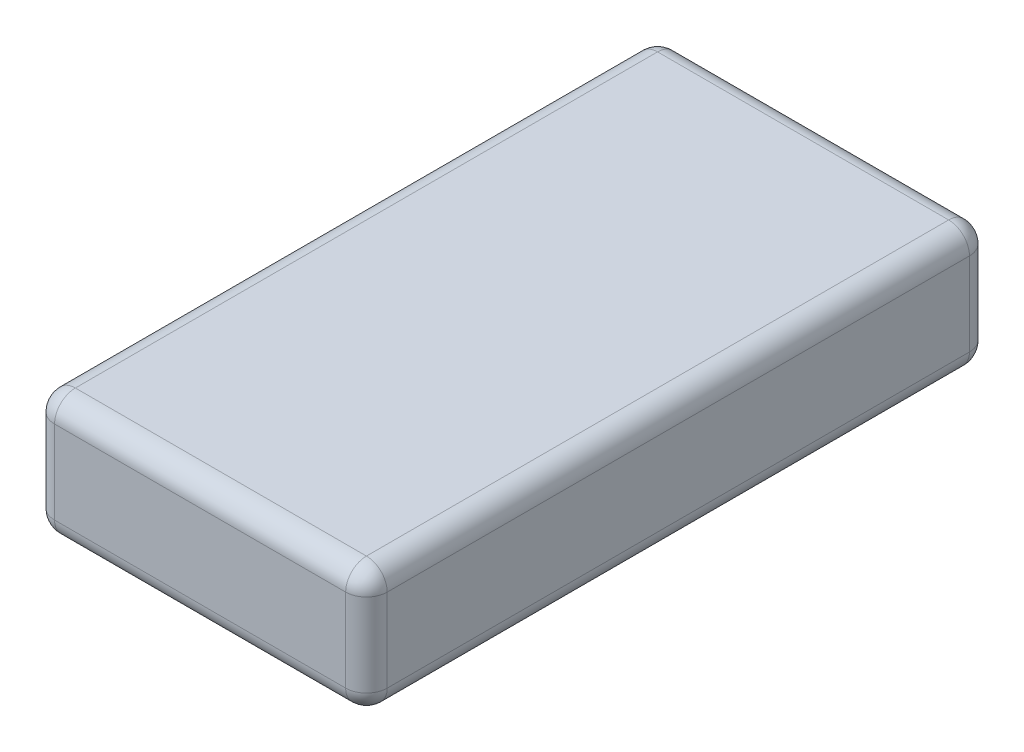
ISO-10303-21;
HEADER;
FILE_DESCRIPTION(('STEP AP214'),'2;1');
FILE_NAME('part.step','',(''),(''),'','','');
FILE_SCHEMA(('AUTOMOTIVE_DESIGN { 1 0 10303 214 1 1 1 1 }'));
ENDSEC;
DATA;
#1=APPLICATION_CONTEXT('core data for automotive mechanical design processes');
#2=APPLICATION_PROTOCOL_DEFINITION('international standard','automotive_design',2000,#1);
#3=PRODUCT_CONTEXT('',#1,'mechanical');
#4=PRODUCT('Part','Part','',(#3));
#5=PRODUCT_RELATED_PRODUCT_CATEGORY('part','',(#4));
#6=PRODUCT_DEFINITION_FORMATION('','',#4);
#7=PRODUCT_DEFINITION_CONTEXT('part definition',#1,'design');
#8=PRODUCT_DEFINITION('design','',#6,#7);
#9=PRODUCT_DEFINITION_SHAPE('','',#8);
#10=(LENGTH_UNIT() NAMED_UNIT(*) SI_UNIT(.MILLI.,.METRE.));
#11=(NAMED_UNIT(*) PLANE_ANGLE_UNIT() SI_UNIT($,.RADIAN.));
#12=(NAMED_UNIT(*) SI_UNIT($,.STERADIAN.) SOLID_ANGLE_UNIT());
#13=UNCERTAINTY_MEASURE_WITH_UNIT(LENGTH_MEASURE(1.E-05),#10,'distance_accuracy_value','');
#14=(GEOMETRIC_REPRESENTATION_CONTEXT(3) GLOBAL_UNCERTAINTY_ASSIGNED_CONTEXT((#13)) GLOBAL_UNIT_ASSIGNED_CONTEXT((#10,
#11,#12)) REPRESENTATION_CONTEXT('',''));
#15=CARTESIAN_POINT('',(0.,0.,0.));
#16=DIRECTION('',(0.,0.,1.));
#17=DIRECTION('',(1.,0.,0.));
#18=AXIS2_PLACEMENT_3D('',#15,#16,#17);
#19=CARTESIAN_POINT('',(-16.,12.,-30.));
#20=DIRECTION('',(1.,0.,0.));
#21=DIRECTION('',(0.,0.,-1.));
#22=AXIS2_PLACEMENT_3D('',#19,#20,#21);
#23=PLANE('',#22);
#24=DIRECTION('',(0.,-1.,0.));
#25=VECTOR('',#24,1.);
#26=CARTESIAN_POINT('',(-16.,12.,28.));
#27=LINE('',#26,#25);
#28=CARTESIAN_POINT('',(-16.,2.,28.));
#29=VERTEX_POINT('',#28);
#30=CARTESIAN_POINT('',(-16.,10.,28.));
#31=VERTEX_POINT('',#30);
#32=EDGE_CURVE('E136',#29,#31,#27,.F.);
#33=ORIENTED_EDGE('',*,*,#32,.T.);
#34=DIRECTION('',(0.,0.,1.));
#35=VECTOR('',#34,1.);
#36=CARTESIAN_POINT('',(-16.,10.,-30.));
#37=LINE('',#36,#35);
#38=CARTESIAN_POINT('',(-16.,10.,-28.));
#39=VERTEX_POINT('',#38);
#40=EDGE_CURVE('E182',#31,#39,#37,.F.);
#41=ORIENTED_EDGE('',*,*,#40,.T.);
#42=DIRECTION('',(0.,-1.,0.));
#43=VECTOR('',#42,1.);
#44=CARTESIAN_POINT('',(-16.,12.,-28.));
#45=LINE('',#44,#43);
#46=CARTESIAN_POINT('',(-16.,2.,-28.));
#47=VERTEX_POINT('',#46);
#48=EDGE_CURVE('E177',#39,#47,#45,.T.);
#49=ORIENTED_EDGE('',*,*,#48,.T.);
#50=DIRECTION('',(0.,0.,1.));
#51=VECTOR('',#50,1.);
#52=CARTESIAN_POINT('',(-16.,2.,-30.));
#53=LINE('',#52,#51);
#54=EDGE_CURVE('E171',#47,#29,#53,.T.);
#55=ORIENTED_EDGE('',*,*,#54,.T.);
#56=EDGE_LOOP('',(#33,#41,#49,#55));
#57=FACE_BOUND('',#56,.T.);
#58=ADVANCED_FACE('F39',(#57),#23,.F.);
#59=CARTESIAN_POINT('',(-16.,12.,30.));
#60=DIRECTION('',(0.,0.,-1.));
#61=DIRECTION('',(-1.,0.,0.));
#62=AXIS2_PLACEMENT_3D('',#59,#60,#61);
#63=PLANE('',#62);
#64=DIRECTION('',(0.,-1.,0.));
#65=VECTOR('',#64,1.);
#66=CARTESIAN_POINT('',(14.,12.,30.));
#67=LINE('',#66,#65);
#68=CARTESIAN_POINT('',(14.,2.,30.));
#69=VERTEX_POINT('',#68);
#70=CARTESIAN_POINT('',(14.,10.,30.));
#71=VERTEX_POINT('',#70);
#72=EDGE_CURVE('E161',#69,#71,#67,.F.);
#73=ORIENTED_EDGE('',*,*,#72,.T.);
#74=DIRECTION('',(1.,0.,0.));
#75=VECTOR('',#74,1.);
#76=CARTESIAN_POINT('',(-16.,10.,30.));
#77=LINE('',#76,#75);
#78=CARTESIAN_POINT('',(-14.,10.,30.));
#79=VERTEX_POINT('',#78);
#80=EDGE_CURVE('E165',#71,#79,#77,.F.);
#81=ORIENTED_EDGE('',*,*,#80,.T.);
#82=DIRECTION('',(0.,-1.,0.));
#83=VECTOR('',#82,1.);
#84=CARTESIAN_POINT('',(-14.,12.,30.));
#85=LINE('',#84,#83);
#86=CARTESIAN_POINT('',(-14.,2.,30.));
#87=VERTEX_POINT('',#86);
#88=EDGE_CURVE('E134',#79,#87,#85,.T.);
#89=ORIENTED_EDGE('',*,*,#88,.T.);
#90=DIRECTION('',(1.,0.,0.));
#91=VECTOR('',#90,1.);
#92=CARTESIAN_POINT('',(-16.,2.,30.));
#93=LINE('',#92,#91);
#94=EDGE_CURVE('E154',#87,#69,#93,.T.);
#95=ORIENTED_EDGE('',*,*,#94,.T.);
#96=EDGE_LOOP('',(#73,#81,#89,#95));
#97=FACE_BOUND('',#96,.T.);
#98=ADVANCED_FACE('F163',(#97),#63,.F.);
#99=CARTESIAN_POINT('',(16.,12.,-30.));
#100=DIRECTION('',(-1.,0.,0.));
#101=DIRECTION('',(0.,0.,1.));
#102=AXIS2_PLACEMENT_3D('',#99,#100,#101);
#103=PLANE('',#102);
#104=DIRECTION('',(0.,-1.,0.));
#105=VECTOR('',#104,1.);
#106=CARTESIAN_POINT('',(16.,12.,-28.));
#107=LINE('',#106,#105);
#108=CARTESIAN_POINT('',(16.,2.,-28.));
#109=VERTEX_POINT('',#108);
#110=CARTESIAN_POINT('',(16.,10.,-28.));
#111=VERTEX_POINT('',#110);
#112=EDGE_CURVE('E188',#109,#111,#107,.F.);
#113=ORIENTED_EDGE('',*,*,#112,.T.);
#114=DIRECTION('',(0.,0.,-1.));
#115=VECTOR('',#114,1.);
#116=CARTESIAN_POINT('',(16.,10.,30.));
#117=LINE('',#116,#115);
#118=CARTESIAN_POINT('',(16.,10.,28.));
#119=VERTEX_POINT('',#118);
#120=EDGE_CURVE('E195',#111,#119,#117,.F.);
#121=ORIENTED_EDGE('',*,*,#120,.T.);
#122=DIRECTION('',(0.,-1.,0.));
#123=VECTOR('',#122,1.);
#124=CARTESIAN_POINT('',(16.,12.,28.));
#125=LINE('',#124,#123);
#126=CARTESIAN_POINT('',(16.,2.,28.));
#127=VERTEX_POINT('',#126);
#128=EDGE_CURVE('E191',#119,#127,#125,.T.);
#129=ORIENTED_EDGE('',*,*,#128,.T.);
#130=DIRECTION('',(0.,0.,-1.));
#131=VECTOR('',#130,1.);
#132=CARTESIAN_POINT('',(16.,2.,-30.));
#133=LINE('',#132,#131);
#134=EDGE_CURVE('E185',#127,#109,#133,.T.);
#135=ORIENTED_EDGE('',*,*,#134,.T.);
#136=EDGE_LOOP('',(#113,#121,#129,#135));
#137=FACE_BOUND('',#136,.T.);
#138=ADVANCED_FACE('F334',(#137),#103,.F.);
#139=CARTESIAN_POINT('',(-16.,12.,-30.));
#140=DIRECTION('',(0.,0.,1.));
#141=DIRECTION('',(1.,0.,0.));
#142=AXIS2_PLACEMENT_3D('',#139,#140,#141);
#143=PLANE('',#142);
#144=DIRECTION('',(0.,-1.,0.));
#145=VECTOR('',#144,1.);
#146=CARTESIAN_POINT('',(-14.,12.,-30.));
#147=LINE('',#146,#145);
#148=CARTESIAN_POINT('',(-14.,2.,-30.));
#149=VERTEX_POINT('',#148);
#150=CARTESIAN_POINT('',(-14.,10.,-30.));
#151=VERTEX_POINT('',#150);
#152=EDGE_CURVE('E201',#149,#151,#147,.F.);
#153=ORIENTED_EDGE('',*,*,#152,.T.);
#154=DIRECTION('',(-1.,0.,0.));
#155=VECTOR('',#154,1.);
#156=CARTESIAN_POINT('',(16.,10.,-30.));
#157=LINE('',#156,#155);
#158=CARTESIAN_POINT('',(14.,10.,-30.));
#159=VERTEX_POINT('',#158);
#160=EDGE_CURVE('E208',#151,#159,#157,.F.);
#161=ORIENTED_EDGE('',*,*,#160,.T.);
#162=DIRECTION('',(0.,-1.,0.));
#163=VECTOR('',#162,1.);
#164=CARTESIAN_POINT('',(14.,12.,-30.));
#165=LINE('',#164,#163);
#166=CARTESIAN_POINT('',(14.,2.,-30.));
#167=VERTEX_POINT('',#166);
#168=EDGE_CURVE('E204',#159,#167,#165,.T.);
#169=ORIENTED_EDGE('',*,*,#168,.T.);
#170=DIRECTION('',(-1.,0.,0.));
#171=VECTOR('',#170,1.);
#172=CARTESIAN_POINT('',(-16.,2.,-30.));
#173=LINE('',#172,#171);
#174=EDGE_CURVE('E198',#167,#149,#173,.T.);
#175=ORIENTED_EDGE('',*,*,#174,.T.);
#176=EDGE_LOOP('',(#153,#161,#169,#175));
#177=FACE_BOUND('',#176,.T.);
#178=ADVANCED_FACE('F345',(#177),#143,.F.);
#179=CARTESIAN_POINT('',(0.,12.,0.));
#180=DIRECTION('',(0.,1.,0.));
#181=DIRECTION('',(0.,0.,1.));
#182=AXIS2_PLACEMENT_3D('',#179,#180,#181);
#183=PLANE('',#182);
#184=DIRECTION('',(0.,0.,-1.));
#185=VECTOR('',#184,1.);
#186=CARTESIAN_POINT('',(14.,12.,-30.));
#187=LINE('',#186,#185);
#188=CARTESIAN_POINT('',(14.,12.,28.));
#189=VERTEX_POINT('',#188);
#190=CARTESIAN_POINT('',(14.,12.,-28.));
#191=VERTEX_POINT('',#190);
#192=EDGE_CURVE('E217',#189,#191,#187,.T.);
#193=ORIENTED_EDGE('',*,*,#192,.T.);
#194=DIRECTION('',(-1.,0.,0.));
#195=VECTOR('',#194,1.);
#196=CARTESIAN_POINT('',(-16.,12.,-28.));
#197=LINE('',#196,#195);
#198=CARTESIAN_POINT('',(-14.,12.,-28.));
#199=VERTEX_POINT('',#198);
#200=EDGE_CURVE('E220',#191,#199,#197,.T.);
#201=ORIENTED_EDGE('',*,*,#200,.T.);
#202=DIRECTION('',(0.,0.,1.));
#203=VECTOR('',#202,1.);
#204=CARTESIAN_POINT('',(-14.,12.,30.));
#205=LINE('',#204,#203);
#206=CARTESIAN_POINT('',(-14.,12.,28.));
#207=VERTEX_POINT('',#206);
#208=EDGE_CURVE('E211',#199,#207,#205,.T.);
#209=ORIENTED_EDGE('',*,*,#208,.T.);
#210=DIRECTION('',(1.,0.,0.));
#211=VECTOR('',#210,1.);
#212=CARTESIAN_POINT('',(16.,12.,28.));
#213=LINE('',#212,#211);
#214=EDGE_CURVE('E214',#207,#189,#213,.T.);
#215=ORIENTED_EDGE('',*,*,#214,.T.);
#216=EDGE_LOOP('',(#193,#201,#209,#215));
#217=FACE_BOUND('',#216,.T.);
#218=ADVANCED_FACE('F326',(#217),#183,.T.);
#219=CARTESIAN_POINT('',(0.,0.,0.));
#220=DIRECTION('',(0.,1.,0.));
#221=DIRECTION('',(0.,0.,1.));
#222=AXIS2_PLACEMENT_3D('',#219,#220,#221);
#223=PLANE('',#222);
#224=DIRECTION('',(0.,0.,-1.));
#225=VECTOR('',#224,1.);
#226=CARTESIAN_POINT('',(14.,0.,0.));
#227=LINE('',#226,#225);
#228=CARTESIAN_POINT('',(14.,0.,-28.));
#229=VERTEX_POINT('',#228);
#230=CARTESIAN_POINT('',(14.,0.,28.));
#231=VERTEX_POINT('',#230);
#232=EDGE_CURVE('E49',#229,#231,#227,.F.);
#233=ORIENTED_EDGE('',*,*,#232,.T.);
#234=DIRECTION('',(1.,0.,0.));
#235=VECTOR('',#234,1.);
#236=CARTESIAN_POINT('',(0.,0.,28.));
#237=LINE('',#236,#235);
#238=CARTESIAN_POINT('',(-14.,0.,28.));
#239=VERTEX_POINT('',#238);
#240=EDGE_CURVE('E11',#231,#239,#237,.F.);
#241=ORIENTED_EDGE('',*,*,#240,.T.);
#242=DIRECTION('',(0.,0.,1.));
#243=VECTOR('',#242,1.);
#244=CARTESIAN_POINT('',(-14.,0.,0.));
#245=LINE('',#244,#243);
#246=CARTESIAN_POINT('',(-14.,0.,-28.));
#247=VERTEX_POINT('',#246);
#248=EDGE_CURVE('E224',#239,#247,#245,.F.);
#249=ORIENTED_EDGE('',*,*,#248,.T.);
#250=DIRECTION('',(-1.,0.,0.));
#251=VECTOR('',#250,1.);
#252=CARTESIAN_POINT('',(0.,0.,-28.));
#253=LINE('',#252,#251);
#254=EDGE_CURVE('E60',#247,#229,#253,.F.);
#255=ORIENTED_EDGE('',*,*,#254,.T.);
#256=EDGE_LOOP('',(#233,#241,#249,#255));
#257=FACE_BOUND('',#256,.T.);
#258=ADVANCED_FACE('F532',(#257),#223,.F.);
#259=CARTESIAN_POINT('',(14.,12.,-28.));
#260=DIRECTION('',(0.,-1.,0.));
#261=DIRECTION('',(0.,0.,-1.));
#262=AXIS2_PLACEMENT_3D('',#259,#260,#261);
#263=CYLINDRICAL_SURFACE('',#262,2.);
#264=CARTESIAN_POINT('',(14.,10.,-28.));
#265=DIRECTION('',(0.,1.,0.));
#266=DIRECTION('',(0.,0.,1.));
#267=AXIS2_PLACEMENT_3D('',#264,#265,#266);
#268=CIRCLE('',#267,2.);
#269=EDGE_CURVE('E43',#111,#159,#268,.T.);
#270=ORIENTED_EDGE('',*,*,#269,.F.);
#271=ORIENTED_EDGE('',*,*,#112,.F.);
#272=CARTESIAN_POINT('',(14.,2.,-28.));
#273=DIRECTION('',(0.,-1.,0.));
#274=DIRECTION('',(0.,0.,-1.));
#275=AXIS2_PLACEMENT_3D('',#272,#273,#274);
#276=CIRCLE('',#275,2.);
#277=EDGE_CURVE('E301',#167,#109,#276,.T.);
#278=ORIENTED_EDGE('',*,*,#277,.F.);
#279=ORIENTED_EDGE('',*,*,#168,.F.);
#280=EDGE_LOOP('',(#270,#271,#278,#279));
#281=FACE_BOUND('',#280,.T.);
#282=ADVANCED_FACE('F41',(#281),#263,.T.);
#283=CARTESIAN_POINT('',(14.,10.,-28.));
#284=DIRECTION('',(0.,0.,-1.));
#285=DIRECTION('',(-1.,0.,0.));
#286=AXIS2_PLACEMENT_3D('',#283,#284,#285);
#287=SPHERICAL_SURFACE('',#286,2.);
#288=CARTESIAN_POINT('',(14.,10.,-28.));
#289=DIRECTION('',(0.,0.,-1.));
#290=DIRECTION('',(-1.,0.,0.));
#291=AXIS2_PLACEMENT_3D('',#288,#289,#290);
#292=CIRCLE('',#291,2.);
#293=EDGE_CURVE('E294',#111,#191,#292,.F.);
#294=ORIENTED_EDGE('',*,*,#293,.F.);
#295=ORIENTED_EDGE('',*,*,#269,.T.);
#296=CARTESIAN_POINT('',(14.,10.,-28.));
#297=DIRECTION('',(1.,0.,0.));
#298=DIRECTION('',(0.,1.,0.));
#299=AXIS2_PLACEMENT_3D('',#296,#297,#298);
#300=CIRCLE('',#299,2.);
#301=EDGE_CURVE('E298',#191,#159,#300,.F.);
#302=ORIENTED_EDGE('',*,*,#301,.F.);
#303=EDGE_LOOP('',(#294,#295,#302));
#304=FACE_BOUND('',#303,.T.);
#305=ADVANCED_FACE('F314',(#304),#287,.T.);
#306=CARTESIAN_POINT('',(14.,2.,-28.));
#307=DIRECTION('',(1.,0.,0.));
#308=DIRECTION('',(0.,0.,-1.));
#309=AXIS2_PLACEMENT_3D('',#306,#307,#308);
#310=SPHERICAL_SURFACE('',#309,2.);
#311=CARTESIAN_POINT('',(14.,2.,-28.));
#312=DIRECTION('',(1.,0.,0.));
#313=DIRECTION('',(0.,0.,-1.));
#314=AXIS2_PLACEMENT_3D('',#311,#312,#313);
#315=CIRCLE('',#314,2.);
#316=EDGE_CURVE('E287',#167,#229,#315,.F.);
#317=ORIENTED_EDGE('',*,*,#316,.F.);
#318=ORIENTED_EDGE('',*,*,#277,.T.);
#319=CARTESIAN_POINT('',(14.,2.,-28.));
#320=DIRECTION('',(0.,0.,-1.));
#321=DIRECTION('',(-1.,0.,0.));
#322=AXIS2_PLACEMENT_3D('',#319,#320,#321);
#323=CIRCLE('',#322,2.);
#324=EDGE_CURVE('E290',#229,#109,#323,.F.);
#325=ORIENTED_EDGE('',*,*,#324,.F.);
#326=EDGE_LOOP('',(#317,#318,#325));
#327=FACE_BOUND('',#326,.T.);
#328=ADVANCED_FACE('F511',(#327),#310,.T.);
#329=CARTESIAN_POINT('',(0.,10.,-28.));
#330=DIRECTION('',(1.,0.,0.));
#331=DIRECTION('',(0.,0.,-1.));
#332=AXIS2_PLACEMENT_3D('',#329,#330,#331);
#333=CYLINDRICAL_SURFACE('',#332,2.);
#334=ORIENTED_EDGE('',*,*,#301,.T.);
#335=ORIENTED_EDGE('',*,*,#160,.F.);
#336=CARTESIAN_POINT('',(-14.,10.,-28.));
#337=DIRECTION('',(-1.,0.,0.));
#338=DIRECTION('',(0.,0.,1.));
#339=AXIS2_PLACEMENT_3D('',#336,#337,#338);
#340=CIRCLE('',#339,2.);
#341=EDGE_CURVE('E279',#199,#151,#340,.T.);
#342=ORIENTED_EDGE('',*,*,#341,.F.);
#343=ORIENTED_EDGE('',*,*,#200,.F.);
#344=EDGE_LOOP('',(#334,#335,#342,#343));
#345=FACE_BOUND('',#344,.T.);
#346=ADVANCED_FACE('F322',(#345),#333,.T.);
#347=CARTESIAN_POINT('',(14.,10.,0.));
#348=DIRECTION('',(0.,0.,1.));
#349=DIRECTION('',(1.,0.,0.));
#350=AXIS2_PLACEMENT_3D('',#347,#348,#349);
#351=CYLINDRICAL_SURFACE('',#350,2.);
#352=ORIENTED_EDGE('',*,*,#293,.T.);
#353=ORIENTED_EDGE('',*,*,#192,.F.);
#354=CARTESIAN_POINT('',(14.,10.,28.));
#355=DIRECTION('',(0.,0.,1.));
#356=DIRECTION('',(1.,0.,0.));
#357=AXIS2_PLACEMENT_3D('',#354,#355,#356);
#358=CIRCLE('',#357,2.);
#359=EDGE_CURVE('E275',#119,#189,#358,.T.);
#360=ORIENTED_EDGE('',*,*,#359,.F.);
#361=ORIENTED_EDGE('',*,*,#120,.F.);
#362=EDGE_LOOP('',(#352,#353,#360,#361));
#363=FACE_BOUND('',#362,.T.);
#364=ADVANCED_FACE('F331',(#363),#351,.T.);
#365=CARTESIAN_POINT('',(14.,12.,28.));
#366=DIRECTION('',(0.,-1.,0.));
#367=DIRECTION('',(0.,0.,-1.));
#368=AXIS2_PLACEMENT_3D('',#365,#366,#367);
#369=CYLINDRICAL_SURFACE('',#368,2.);
#370=CARTESIAN_POINT('',(14.,2.,28.));
#371=DIRECTION('',(0.,-1.,0.));
#372=DIRECTION('',(0.,0.,-1.));
#373=AXIS2_PLACEMENT_3D('',#370,#371,#372);
#374=CIRCLE('',#373,2.);
#375=EDGE_CURVE('E267',#127,#69,#374,.T.);
#376=ORIENTED_EDGE('',*,*,#375,.F.);
#377=ORIENTED_EDGE('',*,*,#128,.F.);
#378=CARTESIAN_POINT('',(14.,10.,28.));
#379=DIRECTION('',(0.,1.,0.));
#380=DIRECTION('',(0.,0.,1.));
#381=AXIS2_PLACEMENT_3D('',#378,#379,#380);
#382=CIRCLE('',#381,2.);
#383=EDGE_CURVE('E271',#71,#119,#382,.T.);
#384=ORIENTED_EDGE('',*,*,#383,.F.);
#385=ORIENTED_EDGE('',*,*,#72,.F.);
#386=EDGE_LOOP('',(#376,#377,#384,#385));
#387=FACE_BOUND('',#386,.T.);
#388=ADVANCED_FACE('F338',(#387),#369,.T.);
#389=CARTESIAN_POINT('',(14.,2.,-30.));
#390=DIRECTION('',(0.,0.,-1.));
#391=DIRECTION('',(-1.,0.,0.));
#392=AXIS2_PLACEMENT_3D('',#389,#390,#391);
#393=CYLINDRICAL_SURFACE('',#392,2.);
#394=ORIENTED_EDGE('',*,*,#324,.T.);
#395=ORIENTED_EDGE('',*,*,#134,.F.);
#396=CARTESIAN_POINT('',(14.,2.,28.));
#397=DIRECTION('',(0.,0.,1.));
#398=DIRECTION('',(1.,0.,0.));
#399=AXIS2_PLACEMENT_3D('',#396,#397,#398);
#400=CIRCLE('',#399,2.);
#401=EDGE_CURVE('E264',#231,#127,#400,.T.);
#402=ORIENTED_EDGE('',*,*,#401,.F.);
#403=ORIENTED_EDGE('',*,*,#232,.F.);
#404=EDGE_LOOP('',(#394,#395,#402,#403));
#405=FACE_BOUND('',#404,.T.);
#406=ADVANCED_FACE('F343',(#405),#393,.T.);
#407=CARTESIAN_POINT('',(-16.,2.,-28.));
#408=DIRECTION('',(-1.,0.,0.));
#409=DIRECTION('',(0.,0.,1.));
#410=AXIS2_PLACEMENT_3D('',#407,#408,#409);
#411=CYLINDRICAL_SURFACE('',#410,2.);
#412=ORIENTED_EDGE('',*,*,#316,.T.);
#413=ORIENTED_EDGE('',*,*,#254,.F.);
#414=CARTESIAN_POINT('',(-14.,2.,-28.));
#415=DIRECTION('',(-1.,0.,0.));
#416=DIRECTION('',(0.,0.,1.));
#417=AXIS2_PLACEMENT_3D('',#414,#415,#416);
#418=CIRCLE('',#417,2.);
#419=EDGE_CURVE('E260',#149,#247,#418,.T.);
#420=ORIENTED_EDGE('',*,*,#419,.F.);
#421=ORIENTED_EDGE('',*,*,#174,.F.);
#422=EDGE_LOOP('',(#412,#413,#420,#421));
#423=FACE_BOUND('',#422,.T.);
#424=ADVANCED_FACE('F354',(#423),#411,.T.);
#425=CARTESIAN_POINT('',(-14.,12.,-28.));
#426=DIRECTION('',(0.,-1.,0.));
#427=DIRECTION('',(0.,0.,-1.));
#428=AXIS2_PLACEMENT_3D('',#425,#426,#427);
#429=CYLINDRICAL_SURFACE('',#428,2.);
#430=CARTESIAN_POINT('',(-14.,10.,-28.));
#431=DIRECTION('',(0.,1.,0.));
#432=DIRECTION('',(0.,0.,1.));
#433=AXIS2_PLACEMENT_3D('',#430,#431,#432);
#434=CIRCLE('',#433,2.);
#435=EDGE_CURVE('E283',#151,#39,#434,.T.);
#436=ORIENTED_EDGE('',*,*,#435,.F.);
#437=ORIENTED_EDGE('',*,*,#152,.F.);
#438=CARTESIAN_POINT('',(-14.,2.,-28.));
#439=DIRECTION('',(0.,-1.,0.));
#440=DIRECTION('',(0.,0.,-1.));
#441=AXIS2_PLACEMENT_3D('',#438,#439,#440);
#442=CIRCLE('',#441,2.);
#443=EDGE_CURVE('E256',#47,#149,#442,.T.);
#444=ORIENTED_EDGE('',*,*,#443,.F.);
#445=ORIENTED_EDGE('',*,*,#48,.F.);
#446=EDGE_LOOP('',(#436,#437,#444,#445));
#447=FACE_BOUND('',#446,.T.);
#448=ADVANCED_FACE('F350',(#447),#429,.T.);
#449=CARTESIAN_POINT('',(-14.,10.,-28.));
#450=DIRECTION('',(0.,0.,-1.));
#451=DIRECTION('',(-1.,0.,0.));
#452=AXIS2_PLACEMENT_3D('',#449,#450,#451);
#453=SPHERICAL_SURFACE('',#452,2.);
#454=ORIENTED_EDGE('',*,*,#341,.T.);
#455=ORIENTED_EDGE('',*,*,#435,.T.);
#456=CARTESIAN_POINT('',(-14.,10.,-28.));
#457=DIRECTION('',(0.,0.,-1.));
#458=DIRECTION('',(-1.,0.,0.));
#459=AXIS2_PLACEMENT_3D('',#456,#457,#458);
#460=CIRCLE('',#459,2.);
#461=EDGE_CURVE('E252',#199,#39,#460,.F.);
#462=ORIENTED_EDGE('',*,*,#461,.F.);
#463=EDGE_LOOP('',(#454,#455,#462));
#464=FACE_BOUND('',#463,.T.);
#465=ADVANCED_FACE('F364',(#464),#453,.T.);
#466=CARTESIAN_POINT('',(14.,10.,28.));
#467=DIRECTION('',(1.,0.,0.));
#468=DIRECTION('',(0.,0.,-1.));
#469=AXIS2_PLACEMENT_3D('',#466,#467,#468);
#470=SPHERICAL_SURFACE('',#469,2.);
#471=ORIENTED_EDGE('',*,*,#383,.T.);
#472=ORIENTED_EDGE('',*,*,#359,.T.);
#473=CARTESIAN_POINT('',(14.,10.,28.));
#474=DIRECTION('',(1.,0.,0.));
#475=DIRECTION('',(0.,0.,-1.));
#476=AXIS2_PLACEMENT_3D('',#473,#474,#475);
#477=CIRCLE('',#476,2.);
#478=EDGE_CURVE('E248',#71,#189,#477,.F.);
#479=ORIENTED_EDGE('',*,*,#478,.F.);
#480=EDGE_LOOP('',(#471,#472,#479));
#481=FACE_BOUND('',#480,.T.);
#482=ADVANCED_FACE('F374',(#481),#470,.T.);
#483=CARTESIAN_POINT('',(14.,2.,28.));
#484=DIRECTION('',(1.,0.,0.));
#485=DIRECTION('',(0.,0.,-1.));
#486=AXIS2_PLACEMENT_3D('',#483,#484,#485);
#487=SPHERICAL_SURFACE('',#486,2.);
#488=ORIENTED_EDGE('',*,*,#401,.T.);
#489=ORIENTED_EDGE('',*,*,#375,.T.);
#490=CARTESIAN_POINT('',(14.,2.,28.));
#491=DIRECTION('',(1.,0.,0.));
#492=DIRECTION('',(0.,0.,-1.));
#493=AXIS2_PLACEMENT_3D('',#490,#491,#492);
#494=CIRCLE('',#493,2.);
#495=EDGE_CURVE('E157',#231,#69,#494,.F.);
#496=ORIENTED_EDGE('',*,*,#495,.F.);
#497=EDGE_LOOP('',(#488,#489,#496));
#498=FACE_BOUND('',#497,.T.);
#499=ADVANCED_FACE('F376',(#498),#487,.T.);
#500=CARTESIAN_POINT('',(-14.,2.,-28.));
#501=DIRECTION('',(0.,0.,-1.));
#502=DIRECTION('',(-1.,0.,0.));
#503=AXIS2_PLACEMENT_3D('',#500,#501,#502);
#504=SPHERICAL_SURFACE('',#503,2.);
#505=ORIENTED_EDGE('',*,*,#443,.T.);
#506=ORIENTED_EDGE('',*,*,#419,.T.);
#507=CARTESIAN_POINT('',(-14.,2.,-28.));
#508=DIRECTION('',(0.,0.,-1.));
#509=DIRECTION('',(-1.,0.,0.));
#510=AXIS2_PLACEMENT_3D('',#507,#508,#509);
#511=CIRCLE('',#510,2.);
#512=EDGE_CURVE('E242',#47,#247,#511,.F.);
#513=ORIENTED_EDGE('',*,*,#512,.F.);
#514=EDGE_LOOP('',(#505,#506,#513));
#515=FACE_BOUND('',#514,.T.);
#516=ADVANCED_FACE('F356',(#515),#504,.T.);
#517=CARTESIAN_POINT('',(-14.,10.,0.));
#518=DIRECTION('',(0.,0.,-1.));
#519=DIRECTION('',(-1.,0.,0.));
#520=AXIS2_PLACEMENT_3D('',#517,#518,#519);
#521=CYLINDRICAL_SURFACE('',#520,2.);
#522=ORIENTED_EDGE('',*,*,#461,.T.);
#523=ORIENTED_EDGE('',*,*,#40,.F.);
#524=CARTESIAN_POINT('',(-14.,10.,28.));
#525=DIRECTION('',(0.,0.,1.));
#526=DIRECTION('',(1.,0.,0.));
#527=AXIS2_PLACEMENT_3D('',#524,#525,#526);
#528=CIRCLE('',#527,2.);
#529=EDGE_CURVE('E238',#207,#31,#528,.T.);
#530=ORIENTED_EDGE('',*,*,#529,.F.);
#531=ORIENTED_EDGE('',*,*,#208,.F.);
#532=EDGE_LOOP('',(#522,#523,#530,#531));
#533=FACE_BOUND('',#532,.T.);
#534=ADVANCED_FACE('F366',(#533),#521,.T.);
#535=CARTESIAN_POINT('',(0.,10.,28.));
#536=DIRECTION('',(-1.,0.,0.));
#537=DIRECTION('',(0.,0.,1.));
#538=AXIS2_PLACEMENT_3D('',#535,#536,#537);
#539=CYLINDRICAL_SURFACE('',#538,2.);
#540=ORIENTED_EDGE('',*,*,#478,.T.);
#541=ORIENTED_EDGE('',*,*,#214,.F.);
#542=CARTESIAN_POINT('',(-14.,10.,28.));
#543=DIRECTION('',(-1.,0.,0.));
#544=DIRECTION('',(0.,0.,1.));
#545=AXIS2_PLACEMENT_3D('',#542,#543,#544);
#546=CIRCLE('',#545,2.);
#547=EDGE_CURVE('E151',#79,#207,#546,.T.);
#548=ORIENTED_EDGE('',*,*,#547,.F.);
#549=ORIENTED_EDGE('',*,*,#80,.F.);
#550=EDGE_LOOP('',(#540,#541,#548,#549));
#551=FACE_BOUND('',#550,.T.);
#552=ADVANCED_FACE('F372',(#551),#539,.T.);
#553=CARTESIAN_POINT('',(-16.,2.,28.));
#554=DIRECTION('',(1.,0.,0.));
#555=DIRECTION('',(0.,0.,-1.));
#556=AXIS2_PLACEMENT_3D('',#553,#554,#555);
#557=CYLINDRICAL_SURFACE('',#556,2.);
#558=ORIENTED_EDGE('',*,*,#495,.T.);
#559=ORIENTED_EDGE('',*,*,#94,.F.);
#560=CARTESIAN_POINT('',(-14.,2.,28.));
#561=DIRECTION('',(-1.,0.,0.));
#562=DIRECTION('',(0.,0.,1.));
#563=AXIS2_PLACEMENT_3D('',#560,#561,#562);
#564=CIRCLE('',#563,2.);
#565=EDGE_CURVE('E142',#239,#87,#564,.T.);
#566=ORIENTED_EDGE('',*,*,#565,.F.);
#567=ORIENTED_EDGE('',*,*,#240,.F.);
#568=EDGE_LOOP('',(#558,#559,#566,#567));
#569=FACE_BOUND('',#568,.T.);
#570=ADVANCED_FACE('F155',(#569),#557,.T.);
#571=CARTESIAN_POINT('',(-14.,2.,-30.));
#572=DIRECTION('',(0.,0.,1.));
#573=DIRECTION('',(1.,0.,0.));
#574=AXIS2_PLACEMENT_3D('',#571,#572,#573);
#575=CYLINDRICAL_SURFACE('',#574,2.);
#576=ORIENTED_EDGE('',*,*,#512,.T.);
#577=ORIENTED_EDGE('',*,*,#248,.F.);
#578=CARTESIAN_POINT('',(-14.,2.,28.));
#579=DIRECTION('',(0.,0.,1.));
#580=DIRECTION('',(1.,0.,0.));
#581=AXIS2_PLACEMENT_3D('',#578,#579,#580);
#582=CIRCLE('',#581,2.);
#583=EDGE_CURVE('E146',#29,#239,#582,.T.);
#584=ORIENTED_EDGE('',*,*,#583,.F.);
#585=ORIENTED_EDGE('',*,*,#54,.F.);
#586=EDGE_LOOP('',(#576,#577,#584,#585));
#587=FACE_BOUND('',#586,.T.);
#588=ADVANCED_FACE('F359',(#587),#575,.T.);
#589=CARTESIAN_POINT('',(-14.,10.,28.));
#590=DIRECTION('',(0.,1.,0.));
#591=DIRECTION('',(0.,0.,1.));
#592=AXIS2_PLACEMENT_3D('',#589,#590,#591);
#593=SPHERICAL_SURFACE('',#592,2.);
#594=ORIENTED_EDGE('',*,*,#547,.T.);
#595=ORIENTED_EDGE('',*,*,#529,.T.);
#596=CARTESIAN_POINT('',(-14.,10.,28.));
#597=DIRECTION('',(0.,1.,0.));
#598=DIRECTION('',(0.,0.,1.));
#599=AXIS2_PLACEMENT_3D('',#596,#597,#598);
#600=CIRCLE('',#599,2.);
#601=EDGE_CURVE('E139',#79,#31,#600,.F.);
#602=ORIENTED_EDGE('',*,*,#601,.F.);
#603=EDGE_LOOP('',(#594,#595,#602));
#604=FACE_BOUND('',#603,.T.);
#605=ADVANCED_FACE('F370',(#604),#593,.T.);
#606=CARTESIAN_POINT('',(-14.,2.,28.));
#607=DIRECTION('',(0.,-1.,0.));
#608=DIRECTION('',(0.,0.,-1.));
#609=AXIS2_PLACEMENT_3D('',#606,#607,#608);
#610=SPHERICAL_SURFACE('',#609,2.);
#611=ORIENTED_EDGE('',*,*,#583,.T.);
#612=ORIENTED_EDGE('',*,*,#565,.T.);
#613=CARTESIAN_POINT('',(-14.,2.,28.));
#614=DIRECTION('',(0.,-1.,0.));
#615=DIRECTION('',(0.,0.,-1.));
#616=AXIS2_PLACEMENT_3D('',#613,#614,#615);
#617=CIRCLE('',#616,2.);
#618=EDGE_CURVE('E130',#29,#87,#617,.F.);
#619=ORIENTED_EDGE('',*,*,#618,.F.);
#620=EDGE_LOOP('',(#611,#612,#619));
#621=FACE_BOUND('',#620,.T.);
#622=ADVANCED_FACE('F144',(#621),#610,.T.);
#623=CARTESIAN_POINT('',(-14.,12.,28.));
#624=DIRECTION('',(0.,-1.,0.));
#625=DIRECTION('',(0.,0.,-1.));
#626=AXIS2_PLACEMENT_3D('',#623,#624,#625);
#627=CYLINDRICAL_SURFACE('',#626,2.);
#628=ORIENTED_EDGE('',*,*,#601,.T.);
#629=ORIENTED_EDGE('',*,*,#32,.F.);
#630=ORIENTED_EDGE('',*,*,#618,.T.);
#631=ORIENTED_EDGE('',*,*,#88,.F.);
#632=EDGE_LOOP('',(#628,#629,#630,#631));
#633=FACE_BOUND('',#632,.T.);
#634=ADVANCED_FACE('F132',(#633),#627,.T.);
#635=CLOSED_SHELL('',(#58,#98,#138,#178,#218,#258,#282,#305,#328,#346,#364,#388,#406,#424,#448,
#465,#482,#499,#516,#534,#552,#570,#588,#605,#622,#634));
#636=MANIFOLD_SOLID_BREP('B2',#635);
#637=ADVANCED_BREP_SHAPE_REPRESENTATION('',(#18,#636),#14);
#638=SHAPE_DEFINITION_REPRESENTATION(#9,#637);
ENDSEC;
END-ISO-10303-21;
